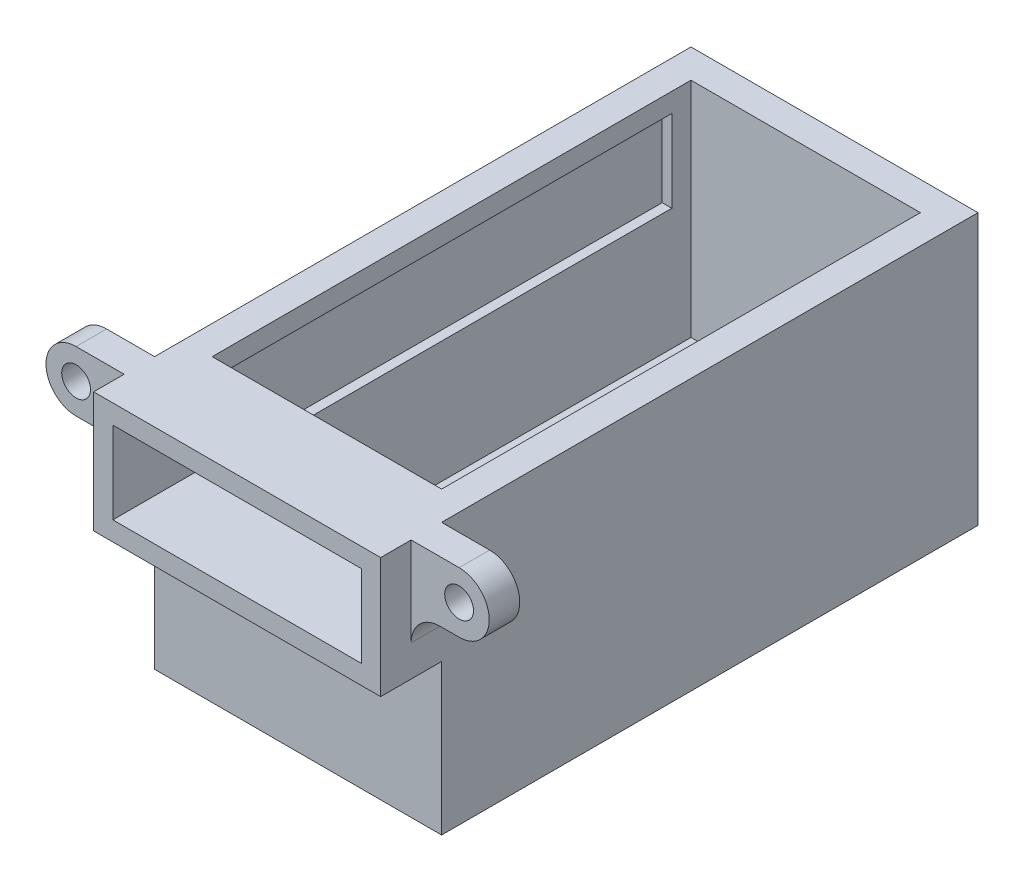
ISO-10303-21;
HEADER;
FILE_DESCRIPTION(('STEP AP214'),'2;1');
FILE_NAME('part.step','',(''),(''),'','','');
FILE_SCHEMA(('AUTOMOTIVE_DESIGN { 1 0 10303 214 1 1 1 1 }'));
ENDSEC;
DATA;
#1=APPLICATION_CONTEXT('core data for automotive mechanical design processes');
#2=APPLICATION_PROTOCOL_DEFINITION('international standard','automotive_design',2000,#1);
#3=PRODUCT_CONTEXT('',#1,'mechanical');
#4=PRODUCT('Part','Part','',(#3));
#5=PRODUCT_RELATED_PRODUCT_CATEGORY('part','',(#4));
#6=PRODUCT_DEFINITION_FORMATION('','',#4);
#7=PRODUCT_DEFINITION_CONTEXT('part definition',#1,'design');
#8=PRODUCT_DEFINITION('design','',#6,#7);
#9=PRODUCT_DEFINITION_SHAPE('','',#8);
#10=(LENGTH_UNIT() NAMED_UNIT(*) SI_UNIT(.MILLI.,.METRE.));
#11=(NAMED_UNIT(*) PLANE_ANGLE_UNIT() SI_UNIT($,.RADIAN.));
#12=(NAMED_UNIT(*) SI_UNIT($,.STERADIAN.) SOLID_ANGLE_UNIT());
#13=UNCERTAINTY_MEASURE_WITH_UNIT(LENGTH_MEASURE(1.E-05),#10,'distance_accuracy_value','');
#14=(GEOMETRIC_REPRESENTATION_CONTEXT(3) GLOBAL_UNCERTAINTY_ASSIGNED_CONTEXT((#13)) GLOBAL_UNIT_ASSIGNED_CONTEXT((#10,
#11,#12)) REPRESENTATION_CONTEXT('',''));
#15=CARTESIAN_POINT('',(0.,0.,0.));
#16=DIRECTION('',(0.,0.,1.));
#17=DIRECTION('',(1.,0.,0.));
#18=AXIS2_PLACEMENT_3D('',#15,#16,#17);
#19=CARTESIAN_POINT('',(0.,0.,-50.88));
#20=DIRECTION('',(0.,0.,-1.));
#21=DIRECTION('',(-1.,0.,0.));
#22=AXIS2_PLACEMENT_3D('',#19,#20,#21);
#23=PLANE('',#22);
#24=DIRECTION('',(-1.,0.,0.));
#25=VECTOR('',#24,1.);
#26=CARTESIAN_POINT('',(2.,10.55,-50.88));
#27=LINE('',#26,#25);
#28=CARTESIAN_POINT('',(27.9,10.55,-50.88));
#29=VERTEX_POINT('',#28);
#30=CARTESIAN_POINT('',(26.9,10.55,-50.88));
#31=VERTEX_POINT('',#30);
#32=EDGE_CURVE('E302',#29,#31,#27,.T.);
#33=ORIENTED_EDGE('',*,*,#32,.T.);
#34=DIRECTION('',(0.,-1.,0.));
#35=VECTOR('',#34,1.);
#36=CARTESIAN_POINT('',(26.9,0.,-50.88));
#37=LINE('',#36,#35);
#38=CARTESIAN_POINT('',(26.9,2.,-50.88));
#39=VERTEX_POINT('',#38);
#40=EDGE_CURVE('E271',#31,#39,#37,.T.);
#41=ORIENTED_EDGE('',*,*,#40,.T.);
#42=DIRECTION('',(1.,0.,0.));
#43=VECTOR('',#42,1.);
#44=CARTESIAN_POINT('',(27.9,2.,-50.88));
#45=LINE('',#44,#43);
#46=CARTESIAN_POINT('',(27.9,2.,-50.88));
#47=VERTEX_POINT('',#46);
#48=EDGE_CURVE('E296',#39,#47,#45,.T.);
#49=ORIENTED_EDGE('',*,*,#48,.T.);
#50=DIRECTION('',(0.,1.,0.));
#51=VECTOR('',#50,1.);
#52=CARTESIAN_POINT('',(27.9,10.55,-50.88));
#53=LINE('',#52,#51);
#54=EDGE_CURVE('E280',#47,#29,#53,.T.);
#55=ORIENTED_EDGE('',*,*,#54,.T.);
#56=EDGE_LOOP('',(#33,#41,#49,#55));
#57=FACE_BOUND('',#56,.T.);
#58=ADVANCED_FACE('F40',(#57),#23,.F.);
#59=CARTESIAN_POINT('',(0.,0.,3.175));
#60=DIRECTION('',(-1.,0.,0.));
#61=DIRECTION('',(0.,0.,1.));
#62=AXIS2_PLACEMENT_3D('',#59,#60,#61);
#63=PLANE('',#62);
#64=DIRECTION('',(0.,-1.,0.));
#65=VECTOR('',#64,1.);
#66=CARTESIAN_POINT('',(0.,0.,3.175));
#67=LINE('',#66,#65);
#68=CARTESIAN_POINT('',(0.,12.55,3.175));
#69=VERTEX_POINT('',#68);
#70=CARTESIAN_POINT('',(0.,3.27500000000001,3.175));
#71=VERTEX_POINT('',#70);
#72=EDGE_CURVE('E362',#69,#71,#67,.T.);
#73=ORIENTED_EDGE('',*,*,#72,.T.);
#74=DIRECTION('',(0.,0.,1.));
#75=VECTOR('',#74,1.);
#76=CARTESIAN_POINT('',(0.,3.27500000000001,-4.24264068711929));
#77=LINE('',#76,#75);
#78=CARTESIAN_POINT('',(0.,3.275,0.));
#79=VERTEX_POINT('',#78);
#80=EDGE_CURVE('E312',#79,#71,#77,.T.);
#81=ORIENTED_EDGE('',*,*,#80,.F.);
#82=DIRECTION('',(0.,1.,0.));
#83=VECTOR('',#82,1.);
#84=CARTESIAN_POINT('',(0.,-15.661,0.));
#85=LINE('',#84,#83);
#86=CARTESIAN_POINT('',(0.,12.55,0.));
#87=VERTEX_POINT('',#86);
#88=EDGE_CURVE('E350',#79,#87,#85,.T.);
#89=ORIENTED_EDGE('',*,*,#88,.T.);
#90=DIRECTION('',(0.,0.,1.));
#91=VECTOR('',#90,1.);
#92=CARTESIAN_POINT('',(0.,12.55,-55.88));
#93=LINE('',#92,#91);
#94=CARTESIAN_POINT('',(0.,12.55,-55.88));
#95=VERTEX_POINT('',#94);
#96=EDGE_CURVE('E353',#95,#87,#93,.T.);
#97=ORIENTED_EDGE('',*,*,#96,.F.);
#98=DIRECTION('',(0.,1.,0.));
#99=VECTOR('',#98,1.);
#100=CARTESIAN_POINT('',(0.,-15.661,-55.88));
#101=LINE('',#100,#99);
#102=CARTESIAN_POINT('',(0.,-15.661,-55.88));
#103=VERTEX_POINT('',#102);
#104=EDGE_CURVE('E339',#103,#95,#101,.T.);
#105=ORIENTED_EDGE('',*,*,#104,.F.);
#106=DIRECTION('',(0.,0.,1.));
#107=VECTOR('',#106,1.);
#108=CARTESIAN_POINT('',(0.,-15.661,-55.88));
#109=LINE('',#108,#107);
#110=CARTESIAN_POINT('',(0.,-15.661,0.));
#111=VERTEX_POINT('',#110);
#112=EDGE_CURVE('E356',#103,#111,#109,.T.);
#113=ORIENTED_EDGE('',*,*,#112,.T.);
#114=CARTESIAN_POINT('',(0.,0.,0.));
#115=VERTEX_POINT('',#114);
#116=EDGE_CURVE('E337',#111,#115,#85,.T.);
#117=ORIENTED_EDGE('',*,*,#116,.T.);
#118=DIRECTION('',(0.,0.,-1.));
#119=VECTOR('',#118,1.);
#120=CARTESIAN_POINT('',(0.,0.,3.175));
#121=LINE('',#120,#119);
#122=CARTESIAN_POINT('',(0.,0.,6.35));
#123=VERTEX_POINT('',#122);
#124=EDGE_CURVE('E406',#123,#115,#121,.T.);
#125=ORIENTED_EDGE('',*,*,#124,.F.);
#126=DIRECTION('',(0.,-1.,0.));
#127=VECTOR('',#126,1.);
#128=CARTESIAN_POINT('',(0.,0.,6.35));
#129=LINE('',#128,#127);
#130=CARTESIAN_POINT('',(0.,12.55,6.35));
#131=VERTEX_POINT('',#130);
#132=EDGE_CURVE('E370',#131,#123,#129,.T.);
#133=ORIENTED_EDGE('',*,*,#132,.F.);
#134=DIRECTION('',(0.,0.,-1.));
#135=VECTOR('',#134,1.);
#136=CARTESIAN_POINT('',(0.,12.55,6.35));
#137=LINE('',#136,#135);
#138=EDGE_CURVE('E373',#131,#69,#137,.T.);
#139=ORIENTED_EDGE('',*,*,#138,.T.);
#140=EDGE_LOOP('',(#73,#81,#89,#97,#105,#113,#117,#125,#133,#139));
#141=FACE_BOUND('',#140,.T.);
#142=ADVANCED_FACE('F465',(#141),#63,.T.);
#143=CARTESIAN_POINT('',(0.,6.275,3.175));
#144=DIRECTION('',(0.,1.,0.));
#145=DIRECTION('',(-1.,0.,0.));
#146=AXIS2_PLACEMENT_3D('',#143,#144,#145);
#147=PLANE('',#146);
#148=DIRECTION('',(0.,0.,1.));
#149=VECTOR('',#148,1.);
#150=CARTESIAN_POINT('',(32.9,6.275,-4.24264068711929));
#151=LINE('',#150,#149);
#152=CARTESIAN_POINT('',(32.9,6.275,0.));
#153=VERTEX_POINT('',#152);
#154=CARTESIAN_POINT('',(32.9,6.275,3.175));
#155=VERTEX_POINT('',#154);
#156=EDGE_CURVE('E329',#153,#155,#151,.T.);
#157=ORIENTED_EDGE('',*,*,#156,.F.);
#158=DIRECTION('',(1.,0.,0.));
#159=VECTOR('',#158,1.);
#160=CARTESIAN_POINT('',(0.,6.275,0.));
#161=LINE('',#160,#159);
#162=CARTESIAN_POINT('',(34.9,6.275,0.));
#163=VERTEX_POINT('',#162);
#164=EDGE_CURVE('E409',#153,#163,#161,.T.);
#165=ORIENTED_EDGE('',*,*,#164,.T.);
#166=DIRECTION('',(0.,0.,-1.));
#167=VECTOR('',#166,1.);
#168=CARTESIAN_POINT('',(34.9,6.275,3.175));
#169=LINE('',#168,#167);
#170=CARTESIAN_POINT('',(34.9,6.275,3.175));
#171=VERTEX_POINT('',#170);
#172=EDGE_CURVE('E436',#171,#163,#169,.T.);
#173=ORIENTED_EDGE('',*,*,#172,.F.);
#174=DIRECTION('',(1.,0.,0.));
#175=VECTOR('',#174,1.);
#176=CARTESIAN_POINT('',(0.,6.275,3.175));
#177=LINE('',#176,#175);
#178=EDGE_CURVE('E385',#155,#171,#177,.T.);
#179=ORIENTED_EDGE('',*,*,#178,.F.);
#180=EDGE_LOOP('',(#157,#165,#173,#179));
#181=FACE_BOUND('',#180,.T.);
#182=ADVANCED_FACE('F472',(#181),#147,.F.);
#183=CARTESIAN_POINT('',(0.,0.,0.));
#184=DIRECTION('',(0.,0.,1.));
#185=DIRECTION('',(1.,0.,0.));
#186=AXIS2_PLACEMENT_3D('',#183,#184,#185);
#187=PLANE('',#186);
#188=CARTESIAN_POINT('',(34.9,9.41250000000001,0.));
#189=DIRECTION('',(0.,0.,1.));
#190=DIRECTION('',(1.,0.,0.));
#191=AXIS2_PLACEMENT_3D('',#188,#189,#190);
#192=CIRCLE('',#191,1.5);
#193=CARTESIAN_POINT('',(36.4,9.41250000000001,0.));
#194=VERTEX_POINT('',#193);
#195=EDGE_CURVE('E388',#194,#194,#192,.T.);
#196=ORIENTED_EDGE('',*,*,#195,.T.);
#197=EDGE_LOOP('',(#196));
#198=FACE_BOUND('',#197,.T.);
#199=DIRECTION('',(0.,-1.,0.));
#200=VECTOR('',#199,1.);
#201=CARTESIAN_POINT('',(29.9,0.,0.));
#202=LINE('',#201,#200);
#203=CARTESIAN_POINT('',(29.9,12.55,0.));
#204=VERTEX_POINT('',#203);
#205=CARTESIAN_POINT('',(29.9,3.27500000000001,0.));
#206=VERTEX_POINT('',#205);
#207=EDGE_CURVE('E344',#204,#206,#202,.T.);
#208=ORIENTED_EDGE('',*,*,#207,.F.);
#209=DIRECTION('',(1.,0.,0.));
#210=VECTOR('',#209,1.);
#211=CARTESIAN_POINT('',(0.,12.55,0.));
#212=LINE('',#211,#210);
#213=CARTESIAN_POINT('',(34.9,12.55,0.));
#214=VERTEX_POINT('',#213);
#215=EDGE_CURVE('E414',#204,#214,#212,.T.);
#216=ORIENTED_EDGE('',*,*,#215,.T.);
#217=CARTESIAN_POINT('',(34.9,9.41250000000001,0.));
#218=DIRECTION('',(0.,0.,1.));
#219=DIRECTION('',(1.,0.,0.));
#220=AXIS2_PLACEMENT_3D('',#217,#218,#219);
#221=CIRCLE('',#220,3.1375);
#222=EDGE_CURVE('E411',#214,#163,#221,.F.);
#223=ORIENTED_EDGE('',*,*,#222,.T.);
#224=ORIENTED_EDGE('',*,*,#164,.F.);
#225=CARTESIAN_POINT('',(32.9,3.275,0.));
#226=DIRECTION('',(0.,0.,1.));
#227=DIRECTION('',(1.,0.,0.));
#228=AXIS2_PLACEMENT_3D('',#225,#226,#227);
#229=CIRCLE('',#228,3.);
#230=EDGE_CURVE('E323',#206,#153,#229,.F.);
#231=ORIENTED_EDGE('',*,*,#230,.F.);
#232=EDGE_LOOP('',(#208,#216,#223,#224,#231));
#233=FACE_BOUND('',#232,.T.);
#234=ADVANCED_FACE('F668',(#198,#233),#187,.F.);
#235=CARTESIAN_POINT('',(-5.,9.4125,0.));
#236=DIRECTION('',(0.,0.,1.));
#237=DIRECTION('',(1.,0.,0.));
#238=AXIS2_PLACEMENT_3D('',#235,#236,#237);
#239=CIRCLE('',#238,1.5);
#240=CARTESIAN_POINT('',(-3.5,9.4125,0.));
#241=VERTEX_POINT('',#240);
#242=EDGE_CURVE('E422',#241,#241,#239,.T.);
#243=ORIENTED_EDGE('',*,*,#242,.T.);
#244=EDGE_LOOP('',(#243));
#245=FACE_BOUND('',#244,.T.);
#246=ORIENTED_EDGE('',*,*,#88,.F.);
#247=CARTESIAN_POINT('',(-3.,3.275,0.));
#248=DIRECTION('',(0.,0.,1.));
#249=DIRECTION('',(1.,0.,0.));
#250=AXIS2_PLACEMENT_3D('',#247,#248,#249);
#251=CIRCLE('',#250,3.);
#252=CARTESIAN_POINT('',(-3.,6.275,0.));
#253=VERTEX_POINT('',#252);
#254=EDGE_CURVE('E311',#79,#253,#251,.T.);
#255=ORIENTED_EDGE('',*,*,#254,.T.);
#256=DIRECTION('',(-1.,0.,0.));
#257=VECTOR('',#256,1.);
#258=CARTESIAN_POINT('',(0.,6.275,0.));
#259=LINE('',#258,#257);
#260=CARTESIAN_POINT('',(-5.,6.275,0.));
#261=VERTEX_POINT('',#260);
#262=EDGE_CURVE('E420',#253,#261,#259,.T.);
#263=ORIENTED_EDGE('',*,*,#262,.T.);
#264=CARTESIAN_POINT('',(-5.,9.4125,0.));
#265=DIRECTION('',(0.,0.,1.));
#266=DIRECTION('',(1.,0.,0.));
#267=AXIS2_PLACEMENT_3D('',#264,#265,#266);
#268=CIRCLE('',#267,3.1375);
#269=CARTESIAN_POINT('',(-5.,12.55,0.));
#270=VERTEX_POINT('',#269);
#271=EDGE_CURVE('E417',#270,#261,#268,.T.);
#272=ORIENTED_EDGE('',*,*,#271,.F.);
#273=EDGE_CURVE('E415',#270,#87,#212,.T.);
#274=ORIENTED_EDGE('',*,*,#273,.T.);
#275=EDGE_LOOP('',(#246,#255,#263,#272,#274));
#276=FACE_BOUND('',#275,.T.);
#277=ADVANCED_FACE('F658',(#245,#276),#187,.F.);
#278=CARTESIAN_POINT('',(0.,0.,3.175));
#279=DIRECTION('',(0.,0.,1.));
#280=DIRECTION('',(1.,0.,0.));
#281=AXIS2_PLACEMENT_3D('',#278,#279,#280);
#282=PLANE('',#281);
#283=ORIENTED_EDGE('',*,*,#72,.F.);
#284=DIRECTION('',(1.,0.,0.));
#285=VECTOR('',#284,1.);
#286=CARTESIAN_POINT('',(0.,12.55,3.175));
#287=LINE('',#286,#285);
#288=CARTESIAN_POINT('',(-5.,12.55,3.175));
#289=VERTEX_POINT('',#288);
#290=EDGE_CURVE('E392',#289,#69,#287,.T.);
#291=ORIENTED_EDGE('',*,*,#290,.F.);
#292=CARTESIAN_POINT('',(-5.,9.4125,3.175));
#293=DIRECTION('',(0.,0.,1.));
#294=DIRECTION('',(1.,0.,0.));
#295=AXIS2_PLACEMENT_3D('',#292,#293,#294);
#296=CIRCLE('',#295,3.1375);
#297=CARTESIAN_POINT('',(-5.,6.275,3.175));
#298=VERTEX_POINT('',#297);
#299=EDGE_CURVE('E395',#289,#298,#296,.T.);
#300=ORIENTED_EDGE('',*,*,#299,.T.);
#301=DIRECTION('',(-1.,0.,0.));
#302=VECTOR('',#301,1.);
#303=CARTESIAN_POINT('',(0.,6.275,3.175));
#304=LINE('',#303,#302);
#305=CARTESIAN_POINT('',(-3.,6.275,3.175));
#306=VERTEX_POINT('',#305);
#307=EDGE_CURVE('E398',#306,#298,#304,.T.);
#308=ORIENTED_EDGE('',*,*,#307,.F.);
#309=CARTESIAN_POINT('',(-3.,3.275,3.175));
#310=DIRECTION('',(0.,0.,-1.));
#311=DIRECTION('',(-1.,0.,0.));
#312=AXIS2_PLACEMENT_3D('',#309,#310,#311);
#313=CIRCLE('',#312,3.);
#314=EDGE_CURVE('E318',#306,#71,#313,.T.);
#315=ORIENTED_EDGE('',*,*,#314,.T.);
#316=EDGE_LOOP('',(#283,#291,#300,#308,#315));
#317=FACE_BOUND('',#316,.T.);
#318=CARTESIAN_POINT('',(-5.,9.4125,3.175));
#319=DIRECTION('',(0.,0.,1.));
#320=DIRECTION('',(1.,0.,0.));
#321=AXIS2_PLACEMENT_3D('',#318,#319,#320);
#322=CIRCLE('',#321,1.5);
#323=CARTESIAN_POINT('',(-3.5,9.4125,3.175));
#324=VERTEX_POINT('',#323);
#325=EDGE_CURVE('E400',#324,#324,#322,.T.);
#326=ORIENTED_EDGE('',*,*,#325,.F.);
#327=EDGE_LOOP('',(#326));
#328=FACE_BOUND('',#327,.T.);
#329=ADVANCED_FACE('F617',(#317,#328),#282,.T.);
#330=CARTESIAN_POINT('',(0.,0.,3.175));
#331=DIRECTION('',(0.,-1.,0.));
#332=DIRECTION('',(1.,0.,0.));
#333=AXIS2_PLACEMENT_3D('',#330,#331,#332);
#334=PLANE('',#333);
#335=DIRECTION('',(-1.,0.,0.));
#336=VECTOR('',#335,1.);
#337=CARTESIAN_POINT('',(0.,0.,0.));
#338=LINE('',#337,#336);
#339=CARTESIAN_POINT('',(29.9,0.,0.));
#340=VERTEX_POINT('',#339);
#341=EDGE_CURVE('E384',#340,#115,#338,.T.);
#342=ORIENTED_EDGE('',*,*,#341,.F.);
#343=DIRECTION('',(0.,0.,-1.));
#344=VECTOR('',#343,1.);
#345=CARTESIAN_POINT('',(29.9,0.,3.175));
#346=LINE('',#345,#344);
#347=CARTESIAN_POINT('',(29.9,0.,6.35));
#348=VERTEX_POINT('',#347);
#349=EDGE_CURVE('E377',#348,#340,#346,.T.);
#350=ORIENTED_EDGE('',*,*,#349,.F.);
#351=DIRECTION('',(1.,0.,0.));
#352=VECTOR('',#351,1.);
#353=CARTESIAN_POINT('',(0.,0.,6.35));
#354=LINE('',#353,#352);
#355=EDGE_CURVE('E363',#123,#348,#354,.T.);
#356=ORIENTED_EDGE('',*,*,#355,.F.);
#357=ORIENTED_EDGE('',*,*,#124,.T.);
#358=EDGE_LOOP('',(#342,#350,#356,#357));
#359=FACE_BOUND('',#358,.T.);
#360=ADVANCED_FACE('F42',(#359),#334,.T.);
#361=CARTESIAN_POINT('',(29.9,0.,3.175));
#362=DIRECTION('',(1.,0.,0.));
#363=DIRECTION('',(0.,0.,-1.));
#364=AXIS2_PLACEMENT_3D('',#361,#362,#363);
#365=PLANE('',#364);
#366=DIRECTION('',(0.,0.,1.));
#367=VECTOR('',#366,1.);
#368=CARTESIAN_POINT('',(29.9,3.27500000000001,-4.24264068711929));
#369=LINE('',#368,#367);
#370=CARTESIAN_POINT('',(29.9,3.27500000000001,3.175));
#371=VERTEX_POINT('',#370);
#372=EDGE_CURVE('E326',#206,#371,#369,.T.);
#373=ORIENTED_EDGE('',*,*,#372,.T.);
#374=DIRECTION('',(0.,1.,0.));
#375=VECTOR('',#374,1.);
#376=CARTESIAN_POINT('',(29.9,0.,3.175));
#377=LINE('',#376,#375);
#378=CARTESIAN_POINT('',(29.9,12.55,3.175));
#379=VERTEX_POINT('',#378);
#380=EDGE_CURVE('E374',#371,#379,#377,.T.);
#381=ORIENTED_EDGE('',*,*,#380,.T.);
#382=DIRECTION('',(0.,0.,-1.));
#383=VECTOR('',#382,1.);
#384=CARTESIAN_POINT('',(29.9,12.55,6.35));
#385=LINE('',#384,#383);
#386=CARTESIAN_POINT('',(29.9,12.55,6.35));
#387=VERTEX_POINT('',#386);
#388=EDGE_CURVE('E381',#387,#379,#385,.T.);
#389=ORIENTED_EDGE('',*,*,#388,.F.);
#390=DIRECTION('',(0.,1.,0.));
#391=VECTOR('',#390,1.);
#392=CARTESIAN_POINT('',(29.9,0.,6.35));
#393=LINE('',#392,#391);
#394=EDGE_CURVE('E366',#348,#387,#393,.T.);
#395=ORIENTED_EDGE('',*,*,#394,.F.);
#396=ORIENTED_EDGE('',*,*,#349,.T.);
#397=CARTESIAN_POINT('',(29.9,-15.661,0.));
#398=VERTEX_POINT('',#397);
#399=EDGE_CURVE('E325',#340,#398,#202,.T.);
#400=ORIENTED_EDGE('',*,*,#399,.T.);
#401=DIRECTION('',(0.,0.,1.));
#402=VECTOR('',#401,1.);
#403=CARTESIAN_POINT('',(29.9,-15.661,-55.88));
#404=LINE('',#403,#402);
#405=CARTESIAN_POINT('',(29.9,-15.661,-55.88));
#406=VERTEX_POINT('',#405);
#407=EDGE_CURVE('E359',#406,#398,#404,.T.);
#408=ORIENTED_EDGE('',*,*,#407,.F.);
#409=DIRECTION('',(0.,-1.,0.));
#410=VECTOR('',#409,1.);
#411=CARTESIAN_POINT('',(29.9,12.55,-55.88));
#412=LINE('',#411,#410);
#413=CARTESIAN_POINT('',(29.9,12.55,-55.88));
#414=VERTEX_POINT('',#413);
#415=EDGE_CURVE('E334',#414,#406,#412,.T.);
#416=ORIENTED_EDGE('',*,*,#415,.F.);
#417=DIRECTION('',(0.,0.,1.));
#418=VECTOR('',#417,1.);
#419=CARTESIAN_POINT('',(29.9,12.55,-55.88));
#420=LINE('',#419,#418);
#421=EDGE_CURVE('E343',#414,#204,#420,.T.);
#422=ORIENTED_EDGE('',*,*,#421,.T.);
#423=ORIENTED_EDGE('',*,*,#207,.T.);
#424=EDGE_LOOP('',(#373,#381,#389,#395,#396,#400,#408,#416,#422,#423));
#425=FACE_BOUND('',#424,.T.);
#426=ADVANCED_FACE('F641',(#425),#365,.T.);
#427=CARTESIAN_POINT('',(34.9,9.41250000000001,3.175));
#428=DIRECTION('',(0.,0.,-1.));
#429=DIRECTION('',(-1.,0.,0.));
#430=AXIS2_PLACEMENT_3D('',#427,#428,#429);
#431=CYLINDRICAL_SURFACE('',#430,3.1375);
#432=ORIENTED_EDGE('',*,*,#222,.F.);
#433=DIRECTION('',(0.,0.,-1.));
#434=VECTOR('',#433,1.);
#435=CARTESIAN_POINT('',(34.9,12.55,3.175));
#436=LINE('',#435,#434);
#437=CARTESIAN_POINT('',(34.9,12.55,3.175));
#438=VERTEX_POINT('',#437);
#439=EDGE_CURVE('E433',#438,#214,#436,.T.);
#440=ORIENTED_EDGE('',*,*,#439,.F.);
#441=CARTESIAN_POINT('',(34.9,9.41250000000001,3.175));
#442=DIRECTION('',(0.,0.,1.));
#443=DIRECTION('',(1.,0.,0.));
#444=AXIS2_PLACEMENT_3D('',#441,#442,#443);
#445=CIRCLE('',#444,3.1375);
#446=EDGE_CURVE('E387',#438,#171,#445,.F.);
#447=ORIENTED_EDGE('',*,*,#446,.T.);
#448=ORIENTED_EDGE('',*,*,#172,.T.);
#449=EDGE_LOOP('',(#432,#440,#447,#448));
#450=FACE_BOUND('',#449,.T.);
#451=ADVANCED_FACE('F646',(#450),#431,.T.);
#452=CARTESIAN_POINT('',(0.,12.55,3.175));
#453=DIRECTION('',(0.,1.,0.));
#454=DIRECTION('',(-1.,0.,0.));
#455=AXIS2_PLACEMENT_3D('',#452,#453,#454);
#456=PLANE('',#455);
#457=DIRECTION('',(0.,0.,-1.));
#458=VECTOR('',#457,1.);
#459=CARTESIAN_POINT('',(26.9,12.55,-3.));
#460=LINE('',#459,#458);
#461=CARTESIAN_POINT('',(26.9,12.55,-3.));
#462=VERTEX_POINT('',#461);
#463=CARTESIAN_POINT('',(26.9,12.55,-52.88));
#464=VERTEX_POINT('',#463);
#465=EDGE_CURVE('E55',#462,#464,#460,.T.);
#466=ORIENTED_EDGE('',*,*,#465,.F.);
#467=DIRECTION('',(1.,0.,0.));
#468=VECTOR('',#467,1.);
#469=CARTESIAN_POINT('',(3.00000000000001,12.55,-3.));
#470=LINE('',#469,#468);
#471=CARTESIAN_POINT('',(3.00000000000001,12.55,-3.));
#472=VERTEX_POINT('',#471);
#473=EDGE_CURVE('E248',#472,#462,#470,.T.);
#474=ORIENTED_EDGE('',*,*,#473,.F.);
#475=DIRECTION('',(0.,0.,1.));
#476=VECTOR('',#475,1.);
#477=CARTESIAN_POINT('',(3.,12.55,-52.88));
#478=LINE('',#477,#476);
#479=CARTESIAN_POINT('',(3.,12.55,-52.88));
#480=VERTEX_POINT('',#479);
#481=EDGE_CURVE('E230',#480,#472,#478,.T.);
#482=ORIENTED_EDGE('',*,*,#481,.F.);
#483=DIRECTION('',(-1.,0.,0.));
#484=VECTOR('',#483,1.);
#485=CARTESIAN_POINT('',(26.9,12.55,-52.88));
#486=LINE('',#485,#484);
#487=EDGE_CURVE('E241',#464,#480,#486,.T.);
#488=ORIENTED_EDGE('',*,*,#487,.F.);
#489=EDGE_LOOP('',(#466,#474,#482,#488));
#490=FACE_BOUND('',#489,.T.);
#491=ORIENTED_EDGE('',*,*,#273,.F.);
#492=DIRECTION('',(0.,0.,-1.));
#493=VECTOR('',#492,1.);
#494=CARTESIAN_POINT('',(-5.,12.55,3.175));
#495=LINE('',#494,#493);
#496=EDGE_CURVE('E431',#289,#270,#495,.T.);
#497=ORIENTED_EDGE('',*,*,#496,.F.);
#498=ORIENTED_EDGE('',*,*,#290,.T.);
#499=ORIENTED_EDGE('',*,*,#138,.F.);
#500=DIRECTION('',(-1.,0.,0.));
#501=VECTOR('',#500,1.);
#502=CARTESIAN_POINT('',(29.9,12.55,6.35));
#503=LINE('',#502,#501);
#504=EDGE_CURVE('E368',#387,#131,#503,.T.);
#505=ORIENTED_EDGE('',*,*,#504,.F.);
#506=ORIENTED_EDGE('',*,*,#388,.T.);
#507=EDGE_CURVE('E391',#379,#438,#287,.T.);
#508=ORIENTED_EDGE('',*,*,#507,.T.);
#509=ORIENTED_EDGE('',*,*,#439,.T.);
#510=ORIENTED_EDGE('',*,*,#215,.F.);
#511=ORIENTED_EDGE('',*,*,#421,.F.);
#512=DIRECTION('',(1.,0.,0.));
#513=VECTOR('',#512,1.);
#514=CARTESIAN_POINT('',(0.,12.55,-55.88));
#515=LINE('',#514,#513);
#516=EDGE_CURVE('E341',#95,#414,#515,.T.);
#517=ORIENTED_EDGE('',*,*,#516,.F.);
#518=ORIENTED_EDGE('',*,*,#96,.T.);
#519=EDGE_LOOP('',(#491,#497,#498,#499,#505,#506,#508,#509,#510,#511,#517,#518));
#520=FACE_BOUND('',#519,.T.);
#521=ADVANCED_FACE('F245',(#490,#520),#456,.T.);
#522=CARTESIAN_POINT('',(-5.,9.4125,3.175));
#523=DIRECTION('',(0.,0.,-1.));
#524=DIRECTION('',(-1.,0.,0.));
#525=AXIS2_PLACEMENT_3D('',#522,#523,#524);
#526=CYLINDRICAL_SURFACE('',#525,3.1375);
#527=ORIENTED_EDGE('',*,*,#271,.T.);
#528=DIRECTION('',(0.,0.,-1.));
#529=VECTOR('',#528,1.);
#530=CARTESIAN_POINT('',(-5.,6.275,3.175));
#531=LINE('',#530,#529);
#532=EDGE_CURVE('E428',#298,#261,#531,.T.);
#533=ORIENTED_EDGE('',*,*,#532,.F.);
#534=ORIENTED_EDGE('',*,*,#299,.F.);
#535=ORIENTED_EDGE('',*,*,#496,.T.);
#536=EDGE_LOOP('',(#527,#533,#534,#535));
#537=FACE_BOUND('',#536,.T.);
#538=ADVANCED_FACE('F631',(#537),#526,.T.);
#539=CARTESIAN_POINT('',(0.,6.275,3.175));
#540=DIRECTION('',(0.,-1.,0.));
#541=DIRECTION('',(0.,0.,-1.));
#542=AXIS2_PLACEMENT_3D('',#539,#540,#541);
#543=PLANE('',#542);
#544=DIRECTION('',(0.,0.,1.));
#545=VECTOR('',#544,1.);
#546=CARTESIAN_POINT('',(-3.,6.275,-4.24264068711929));
#547=LINE('',#546,#545);
#548=EDGE_CURVE('E315',#253,#306,#547,.T.);
#549=ORIENTED_EDGE('',*,*,#548,.T.);
#550=ORIENTED_EDGE('',*,*,#307,.T.);
#551=ORIENTED_EDGE('',*,*,#532,.T.);
#552=ORIENTED_EDGE('',*,*,#262,.F.);
#553=EDGE_LOOP('',(#549,#550,#551,#552));
#554=FACE_BOUND('',#553,.T.);
#555=ADVANCED_FACE('F625',(#554),#543,.T.);
#556=CARTESIAN_POINT('',(-5.,9.4125,3.175));
#557=DIRECTION('',(0.,0.,-1.));
#558=DIRECTION('',(-1.,0.,0.));
#559=AXIS2_PLACEMENT_3D('',#556,#557,#558);
#560=CYLINDRICAL_SURFACE('',#559,1.5);
#561=ORIENTED_EDGE('',*,*,#325,.T.);
#562=EDGE_LOOP('',(#561));
#563=FACE_BOUND('',#562,.T.);
#564=ORIENTED_EDGE('',*,*,#242,.F.);
#565=EDGE_LOOP('',(#564));
#566=FACE_BOUND('',#565,.T.);
#567=ADVANCED_FACE('F630',(#563,#566),#560,.F.);
#568=CARTESIAN_POINT('',(34.9,9.41250000000001,3.175));
#569=DIRECTION('',(0.,0.,-1.));
#570=DIRECTION('',(-1.,0.,0.));
#571=AXIS2_PLACEMENT_3D('',#568,#569,#570);
#572=CYLINDRICAL_SURFACE('',#571,1.5);
#573=CARTESIAN_POINT('',(34.9,9.41250000000001,3.175));
#574=DIRECTION('',(0.,0.,1.));
#575=DIRECTION('',(1.,0.,0.));
#576=AXIS2_PLACEMENT_3D('',#573,#574,#575);
#577=CIRCLE('',#576,1.5);
#578=CARTESIAN_POINT('',(36.4,9.41250000000001,3.175));
#579=VERTEX_POINT('',#578);
#580=EDGE_CURVE('E403',#579,#579,#577,.T.);
#581=ORIENTED_EDGE('',*,*,#580,.T.);
#582=EDGE_LOOP('',(#581));
#583=FACE_BOUND('',#582,.T.);
#584=ORIENTED_EDGE('',*,*,#195,.F.);
#585=EDGE_LOOP('',(#584));
#586=FACE_BOUND('',#585,.T.);
#587=ADVANCED_FACE('F614',(#583,#586),#572,.F.);
#588=ORIENTED_EDGE('',*,*,#380,.F.);
#589=CARTESIAN_POINT('',(32.9,3.275,3.175));
#590=DIRECTION('',(0.,0.,1.));
#591=DIRECTION('',(1.,0.,0.));
#592=AXIS2_PLACEMENT_3D('',#589,#590,#591);
#593=CIRCLE('',#592,3.);
#594=EDGE_CURVE('E321',#155,#371,#593,.T.);
#595=ORIENTED_EDGE('',*,*,#594,.F.);
#596=ORIENTED_EDGE('',*,*,#178,.T.);
#597=ORIENTED_EDGE('',*,*,#446,.F.);
#598=ORIENTED_EDGE('',*,*,#507,.F.);
#599=EDGE_LOOP('',(#588,#595,#596,#597,#598));
#600=FACE_BOUND('',#599,.T.);
#601=ORIENTED_EDGE('',*,*,#580,.F.);
#602=EDGE_LOOP('',(#601));
#603=FACE_BOUND('',#602,.T.);
#604=ADVANCED_FACE('F610',(#600,#603),#282,.T.);
#605=CARTESIAN_POINT('',(0.,0.,6.35));
#606=DIRECTION('',(0.,0.,1.));
#607=DIRECTION('',(1.,0.,0.));
#608=AXIS2_PLACEMENT_3D('',#605,#606,#607);
#609=PLANE('',#608);
#610=DIRECTION('',(0.,1.,0.));
#611=VECTOR('',#610,1.);
#612=CARTESIAN_POINT('',(27.9,10.55,6.35));
#613=LINE('',#612,#611);
#614=CARTESIAN_POINT('',(27.9,2.,6.35));
#615=VERTEX_POINT('',#614);
#616=CARTESIAN_POINT('',(27.9,10.55,6.35));
#617=VERTEX_POINT('',#616);
#618=EDGE_CURVE('E284',#615,#617,#613,.T.);
#619=ORIENTED_EDGE('',*,*,#618,.F.);
#620=DIRECTION('',(1.,0.,0.));
#621=VECTOR('',#620,1.);
#622=CARTESIAN_POINT('',(27.9,2.,6.35));
#623=LINE('',#622,#621);
#624=CARTESIAN_POINT('',(2.,2.,6.35));
#625=VERTEX_POINT('',#624);
#626=EDGE_CURVE('E277',#625,#615,#623,.T.);
#627=ORIENTED_EDGE('',*,*,#626,.F.);
#628=DIRECTION('',(0.,-1.,0.));
#629=VECTOR('',#628,1.);
#630=CARTESIAN_POINT('',(2.,2.,6.35));
#631=LINE('',#630,#629);
#632=CARTESIAN_POINT('',(2.,10.55,6.35));
#633=VERTEX_POINT('',#632);
#634=EDGE_CURVE('E278',#633,#625,#631,.T.);
#635=ORIENTED_EDGE('',*,*,#634,.F.);
#636=DIRECTION('',(-1.,0.,0.));
#637=VECTOR('',#636,1.);
#638=CARTESIAN_POINT('',(2.,10.55,6.35));
#639=LINE('',#638,#637);
#640=EDGE_CURVE('E281',#617,#633,#639,.T.);
#641=ORIENTED_EDGE('',*,*,#640,.F.);
#642=EDGE_LOOP('',(#619,#627,#635,#641));
#643=FACE_BOUND('',#642,.T.);
#644=ORIENTED_EDGE('',*,*,#355,.T.);
#645=ORIENTED_EDGE('',*,*,#394,.T.);
#646=ORIENTED_EDGE('',*,*,#504,.T.);
#647=ORIENTED_EDGE('',*,*,#132,.T.);
#648=EDGE_LOOP('',(#644,#645,#646,#647));
#649=FACE_BOUND('',#648,.T.);
#650=ADVANCED_FACE('F500',(#643,#649),#609,.T.);
#651=CARTESIAN_POINT('',(0.,0.,0.));
#652=DIRECTION('',(0.,0.,-1.));
#653=DIRECTION('',(-1.,0.,0.));
#654=AXIS2_PLACEMENT_3D('',#651,#652,#653);
#655=PLANE('',#654);
#656=ORIENTED_EDGE('',*,*,#399,.F.);
#657=ORIENTED_EDGE('',*,*,#341,.T.);
#658=ORIENTED_EDGE('',*,*,#116,.F.);
#659=DIRECTION('',(-1.,0.,0.));
#660=VECTOR('',#659,1.);
#661=CARTESIAN_POINT('',(29.9,-15.661,0.));
#662=LINE('',#661,#660);
#663=EDGE_CURVE('E346',#398,#111,#662,.T.);
#664=ORIENTED_EDGE('',*,*,#663,.F.);
#665=EDGE_LOOP('',(#656,#657,#658,#664));
#666=FACE_BOUND('',#665,.T.);
#667=ADVANCED_FACE('F714',(#666),#655,.F.);
#668=CARTESIAN_POINT('',(29.9,-15.661,-55.88));
#669=DIRECTION('',(0.,1.,0.));
#670=DIRECTION('',(0.,0.,1.));
#671=AXIS2_PLACEMENT_3D('',#668,#669,#670);
#672=PLANE('',#671);
#673=ORIENTED_EDGE('',*,*,#663,.T.);
#674=ORIENTED_EDGE('',*,*,#112,.F.);
#675=DIRECTION('',(-1.,0.,0.));
#676=VECTOR('',#675,1.);
#677=CARTESIAN_POINT('',(29.9,-15.661,-55.88));
#678=LINE('',#677,#676);
#679=EDGE_CURVE('E336',#406,#103,#678,.T.);
#680=ORIENTED_EDGE('',*,*,#679,.F.);
#681=ORIENTED_EDGE('',*,*,#407,.T.);
#682=EDGE_LOOP('',(#673,#674,#680,#681));
#683=FACE_BOUND('',#682,.T.);
#684=ADVANCED_FACE('F704',(#683),#672,.F.);
#685=CARTESIAN_POINT('',(0.,0.,-55.88));
#686=DIRECTION('',(0.,0.,-1.));
#687=DIRECTION('',(-1.,0.,0.));
#688=AXIS2_PLACEMENT_3D('',#685,#686,#687);
#689=PLANE('',#688);
#690=ORIENTED_EDGE('',*,*,#415,.T.);
#691=ORIENTED_EDGE('',*,*,#679,.T.);
#692=ORIENTED_EDGE('',*,*,#104,.T.);
#693=ORIENTED_EDGE('',*,*,#516,.T.);
#694=EDGE_LOOP('',(#690,#691,#692,#693));
#695=FACE_BOUND('',#694,.T.);
#696=ADVANCED_FACE('F600',(#695),#689,.T.);
#697=CARTESIAN_POINT('',(32.9,3.275,-4.24264068711929));
#698=DIRECTION('',(0.,0.,1.));
#699=DIRECTION('',(1.,0.,0.));
#700=AXIS2_PLACEMENT_3D('',#697,#698,#699);
#701=CYLINDRICAL_SURFACE('',#700,3.);
#702=ORIENTED_EDGE('',*,*,#372,.F.);
#703=ORIENTED_EDGE('',*,*,#230,.T.);
#704=ORIENTED_EDGE('',*,*,#156,.T.);
#705=ORIENTED_EDGE('',*,*,#594,.T.);
#706=EDGE_LOOP('',(#702,#703,#704,#705));
#707=FACE_BOUND('',#706,.T.);
#708=ADVANCED_FACE('F487',(#707),#701,.F.);
#709=CARTESIAN_POINT('',(-3.,3.275,-4.24264068711929));
#710=DIRECTION('',(0.,0.,1.));
#711=DIRECTION('',(1.,0.,0.));
#712=AXIS2_PLACEMENT_3D('',#709,#710,#711);
#713=CYLINDRICAL_SURFACE('',#712,3.);
#714=ORIENTED_EDGE('',*,*,#254,.F.);
#715=ORIENTED_EDGE('',*,*,#80,.T.);
#716=ORIENTED_EDGE('',*,*,#314,.F.);
#717=ORIENTED_EDGE('',*,*,#548,.F.);
#718=EDGE_LOOP('',(#714,#715,#716,#717));
#719=FACE_BOUND('',#718,.T.);
#720=ADVANCED_FACE('F479',(#719),#713,.F.);
#721=CARTESIAN_POINT('',(2.,2.,-50.88));
#722=VERTEX_POINT('',#721);
#723=CARTESIAN_POINT('',(3.,2.,-50.88));
#724=VERTEX_POINT('',#723);
#725=EDGE_CURVE('E292',#722,#724,#45,.T.);
#726=ORIENTED_EDGE('',*,*,#725,.T.);
#727=DIRECTION('',(0.,1.,0.));
#728=VECTOR('',#727,1.);
#729=CARTESIAN_POINT('',(3.,0.,-50.88));
#730=LINE('',#729,#728);
#731=CARTESIAN_POINT('',(3.,10.55,-50.88));
#732=VERTEX_POINT('',#731);
#733=EDGE_CURVE('E63',#724,#732,#730,.T.);
#734=ORIENTED_EDGE('',*,*,#733,.T.);
#735=CARTESIAN_POINT('',(2.,10.55,-50.88));
#736=VERTEX_POINT('',#735);
#737=EDGE_CURVE('E305',#732,#736,#27,.T.);
#738=ORIENTED_EDGE('',*,*,#737,.T.);
#739=DIRECTION('',(0.,-1.,0.));
#740=VECTOR('',#739,1.);
#741=CARTESIAN_POINT('',(2.,2.,-50.88));
#742=LINE('',#741,#740);
#743=EDGE_CURVE('E297',#736,#722,#742,.T.);
#744=ORIENTED_EDGE('',*,*,#743,.T.);
#745=EDGE_LOOP('',(#726,#734,#738,#744));
#746=FACE_BOUND('',#745,.T.);
#747=ADVANCED_FACE('F468',(#746),#23,.F.);
#748=CARTESIAN_POINT('',(27.9,10.55,-83.1547593939892));
#749=DIRECTION('',(1.,0.,0.));
#750=DIRECTION('',(0.,0.,-1.));
#751=AXIS2_PLACEMENT_3D('',#748,#749,#750);
#752=PLANE('',#751);
#753=DIRECTION('',(0.,0.,1.));
#754=VECTOR('',#753,1.);
#755=CARTESIAN_POINT('',(27.9,2.,-83.1547593939892));
#756=LINE('',#755,#754);
#757=EDGE_CURVE('E295',#47,#615,#756,.T.);
#758=ORIENTED_EDGE('',*,*,#757,.T.);
#759=ORIENTED_EDGE('',*,*,#618,.T.);
#760=DIRECTION('',(0.,0.,1.));
#761=VECTOR('',#760,1.);
#762=CARTESIAN_POINT('',(27.9,10.55,-83.1547593939892));
#763=LINE('',#762,#761);
#764=EDGE_CURVE('E291',#29,#617,#763,.T.);
#765=ORIENTED_EDGE('',*,*,#764,.F.);
#766=ORIENTED_EDGE('',*,*,#54,.F.);
#767=EDGE_LOOP('',(#758,#759,#765,#766));
#768=FACE_BOUND('',#767,.T.);
#769=ADVANCED_FACE('F478',(#768),#752,.F.);
#770=CARTESIAN_POINT('',(2.,10.55,-83.1547593939892));
#771=DIRECTION('',(0.,1.,0.));
#772=DIRECTION('',(0.,0.,1.));
#773=AXIS2_PLACEMENT_3D('',#770,#771,#772);
#774=PLANE('',#773);
#775=DIRECTION('',(1.,0.,0.));
#776=VECTOR('',#775,1.);
#777=CARTESIAN_POINT('',(2.,10.55,-3.));
#778=LINE('',#777,#776);
#779=CARTESIAN_POINT('',(3.00000000000001,10.55,-3.));
#780=VERTEX_POINT('',#779);
#781=CARTESIAN_POINT('',(26.9,10.55,-3.));
#782=VERTEX_POINT('',#781);
#783=EDGE_CURVE('E268',#780,#782,#778,.T.);
#784=ORIENTED_EDGE('',*,*,#783,.T.);
#785=DIRECTION('',(0.,0.,-1.));
#786=VECTOR('',#785,1.);
#787=CARTESIAN_POINT('',(26.9,10.55,-83.1547593939892));
#788=LINE('',#787,#786);
#789=EDGE_CURVE('E274',#782,#31,#788,.T.);
#790=ORIENTED_EDGE('',*,*,#789,.T.);
#791=ORIENTED_EDGE('',*,*,#32,.F.);
#792=ORIENTED_EDGE('',*,*,#764,.T.);
#793=ORIENTED_EDGE('',*,*,#640,.T.);
#794=DIRECTION('',(0.,0.,1.));
#795=VECTOR('',#794,1.);
#796=CARTESIAN_POINT('',(2.,10.55,-83.1547593939892));
#797=LINE('',#796,#795);
#798=EDGE_CURVE('E301',#736,#633,#797,.T.);
#799=ORIENTED_EDGE('',*,*,#798,.F.);
#800=ORIENTED_EDGE('',*,*,#737,.F.);
#801=DIRECTION('',(0.,0.,1.));
#802=VECTOR('',#801,1.);
#803=CARTESIAN_POINT('',(3.,10.55,-83.1547593939892));
#804=LINE('',#803,#802);
#805=EDGE_CURVE('E265',#732,#780,#804,.T.);
#806=ORIENTED_EDGE('',*,*,#805,.T.);
#807=EDGE_LOOP('',(#784,#790,#791,#792,#793,#799,#800,#806));
#808=FACE_BOUND('',#807,.T.);
#809=ADVANCED_FACE('F485',(#808),#774,.F.);
#810=CARTESIAN_POINT('',(2.,2.,-83.1547593939892));
#811=DIRECTION('',(-1.,0.,0.));
#812=DIRECTION('',(0.,-1.,0.));
#813=AXIS2_PLACEMENT_3D('',#810,#811,#812);
#814=PLANE('',#813);
#815=ORIENTED_EDGE('',*,*,#798,.T.);
#816=ORIENTED_EDGE('',*,*,#634,.T.);
#817=DIRECTION('',(0.,0.,1.));
#818=VECTOR('',#817,1.);
#819=CARTESIAN_POINT('',(2.,2.,-83.1547593939892));
#820=LINE('',#819,#818);
#821=EDGE_CURVE('E300',#722,#625,#820,.T.);
#822=ORIENTED_EDGE('',*,*,#821,.F.);
#823=ORIENTED_EDGE('',*,*,#743,.F.);
#824=EDGE_LOOP('',(#815,#816,#822,#823));
#825=FACE_BOUND('',#824,.T.);
#826=ADVANCED_FACE('F494',(#825),#814,.F.);
#827=CARTESIAN_POINT('',(27.9,2.,-83.1547593939892));
#828=DIRECTION('',(0.,-1.,0.));
#829=DIRECTION('',(1.,0.,0.));
#830=AXIS2_PLACEMENT_3D('',#827,#828,#829);
#831=PLANE('',#830);
#832=ORIENTED_EDGE('',*,*,#48,.F.);
#833=DIRECTION('',(0.,0.,1.));
#834=VECTOR('',#833,1.);
#835=CARTESIAN_POINT('',(26.9,2.,-83.1547593939892));
#836=LINE('',#835,#834);
#837=CARTESIAN_POINT('',(26.9,2.,-3.));
#838=VERTEX_POINT('',#837);
#839=EDGE_CURVE('E12',#39,#838,#836,.T.);
#840=ORIENTED_EDGE('',*,*,#839,.T.);
#841=DIRECTION('',(-1.,0.,0.));
#842=VECTOR('',#841,1.);
#843=CARTESIAN_POINT('',(27.9,2.,-3.));
#844=LINE('',#843,#842);
#845=CARTESIAN_POINT('',(3.00000000000001,2.,-3.));
#846=VERTEX_POINT('',#845);
#847=EDGE_CURVE('E48',#838,#846,#844,.T.);
#848=ORIENTED_EDGE('',*,*,#847,.T.);
#849=DIRECTION('',(0.,0.,-1.));
#850=VECTOR('',#849,1.);
#851=CARTESIAN_POINT('',(3.,2.,-83.1547593939892));
#852=LINE('',#851,#850);
#853=EDGE_CURVE('E440',#846,#724,#852,.T.);
#854=ORIENTED_EDGE('',*,*,#853,.T.);
#855=ORIENTED_EDGE('',*,*,#725,.F.);
#856=ORIENTED_EDGE('',*,*,#821,.T.);
#857=ORIENTED_EDGE('',*,*,#626,.T.);
#858=ORIENTED_EDGE('',*,*,#757,.F.);
#859=EDGE_LOOP('',(#832,#840,#848,#854,#855,#856,#857,#858));
#860=FACE_BOUND('',#859,.T.);
#861=ADVANCED_FACE('F444',(#860),#831,.F.);
#862=CARTESIAN_POINT('',(26.9,-70.9712558301804,-3.));
#863=DIRECTION('',(1.,0.,0.));
#864=DIRECTION('',(0.,1.,0.));
#865=AXIS2_PLACEMENT_3D('',#862,#863,#864);
#866=PLANE('',#865);
#867=DIRECTION('',(0.,1.,0.));
#868=VECTOR('',#867,1.);
#869=CARTESIAN_POINT('',(26.9,-70.9712558301804,-3.));
#870=LINE('',#869,#868);
#871=EDGE_CURVE('E256',#782,#462,#870,.T.);
#872=ORIENTED_EDGE('',*,*,#871,.T.);
#873=ORIENTED_EDGE('',*,*,#465,.T.);
#874=DIRECTION('',(0.,1.,0.));
#875=VECTOR('',#874,1.);
#876=CARTESIAN_POINT('',(26.9,-70.9712558301804,-52.88));
#877=LINE('',#876,#875);
#878=CARTESIAN_POINT('',(26.9,-10.661,-52.88));
#879=VERTEX_POINT('',#878);
#880=EDGE_CURVE('E238',#879,#464,#877,.T.);
#881=ORIENTED_EDGE('',*,*,#880,.F.);
#882=DIRECTION('',(0.,0.,1.));
#883=VECTOR('',#882,1.);
#884=CARTESIAN_POINT('',(26.9,-10.661,-3.));
#885=LINE('',#884,#883);
#886=CARTESIAN_POINT('',(26.9,-10.661,-3.));
#887=VERTEX_POINT('',#886);
#888=EDGE_CURVE('E263',#879,#887,#885,.T.);
#889=ORIENTED_EDGE('',*,*,#888,.T.);
#890=EDGE_CURVE('E253',#887,#838,#870,.T.);
#891=ORIENTED_EDGE('',*,*,#890,.T.);
#892=ORIENTED_EDGE('',*,*,#839,.F.);
#893=ORIENTED_EDGE('',*,*,#40,.F.);
#894=ORIENTED_EDGE('',*,*,#789,.F.);
#895=EDGE_LOOP('',(#872,#873,#881,#889,#891,#892,#893,#894));
#896=FACE_BOUND('',#895,.T.);
#897=ADVANCED_FACE('F448',(#896),#866,.F.);
#898=CARTESIAN_POINT('',(3.00000000000002,-70.9712558301804,-3.));
#899=DIRECTION('',(0.,0.,1.));
#900=DIRECTION('',(1.,0.,0.));
#901=AXIS2_PLACEMENT_3D('',#898,#899,#900);
#902=PLANE('',#901);
#903=DIRECTION('',(0.,1.,0.));
#904=VECTOR('',#903,1.);
#905=CARTESIAN_POINT('',(3.00000000000002,-70.9712558301804,-3.));
#906=LINE('',#905,#904);
#907=EDGE_CURVE('E237',#780,#472,#906,.T.);
#908=ORIENTED_EDGE('',*,*,#907,.T.);
#909=ORIENTED_EDGE('',*,*,#473,.T.);
#910=ORIENTED_EDGE('',*,*,#871,.F.);
#911=ORIENTED_EDGE('',*,*,#783,.F.);
#912=EDGE_LOOP('',(#908,#909,#910,#911));
#913=FACE_BOUND('',#912,.T.);
#914=ADVANCED_FACE('F508',(#913),#902,.F.);
#915=ORIENTED_EDGE('',*,*,#890,.F.);
#916=DIRECTION('',(-1.,0.,0.));
#917=VECTOR('',#916,1.);
#918=CARTESIAN_POINT('',(3.00000000000002,-10.661,-3.));
#919=LINE('',#918,#917);
#920=CARTESIAN_POINT('',(3.00000000000001,-10.661,-3.));
#921=VERTEX_POINT('',#920);
#922=EDGE_CURVE('E452',#887,#921,#919,.T.);
#923=ORIENTED_EDGE('',*,*,#922,.T.);
#924=EDGE_CURVE('E257',#921,#846,#906,.T.);
#925=ORIENTED_EDGE('',*,*,#924,.T.);
#926=ORIENTED_EDGE('',*,*,#847,.F.);
#927=EDGE_LOOP('',(#915,#923,#925,#926));
#928=FACE_BOUND('',#927,.T.);
#929=ADVANCED_FACE('F447',(#928),#902,.F.);
#930=CARTESIAN_POINT('',(3.00000000000001,-70.9712558301804,-52.88));
#931=DIRECTION('',(-1.,0.,0.));
#932=DIRECTION('',(0.,-1.,0.));
#933=AXIS2_PLACEMENT_3D('',#930,#931,#932);
#934=PLANE('',#933);
#935=ORIENTED_EDGE('',*,*,#733,.F.);
#936=ORIENTED_EDGE('',*,*,#853,.F.);
#937=ORIENTED_EDGE('',*,*,#924,.F.);
#938=DIRECTION('',(0.,0.,-1.));
#939=VECTOR('',#938,1.);
#940=CARTESIAN_POINT('',(3.,-10.661,-52.88));
#941=LINE('',#940,#939);
#942=CARTESIAN_POINT('',(3.,-10.661,-52.88));
#943=VERTEX_POINT('',#942);
#944=EDGE_CURVE('E234',#921,#943,#941,.T.);
#945=ORIENTED_EDGE('',*,*,#944,.T.);
#946=DIRECTION('',(0.,1.,0.));
#947=VECTOR('',#946,1.);
#948=CARTESIAN_POINT('',(3.00000000000001,-70.9712558301804,-52.88));
#949=LINE('',#948,#947);
#950=EDGE_CURVE('E225',#943,#480,#949,.T.);
#951=ORIENTED_EDGE('',*,*,#950,.T.);
#952=ORIENTED_EDGE('',*,*,#481,.T.);
#953=ORIENTED_EDGE('',*,*,#907,.F.);
#954=ORIENTED_EDGE('',*,*,#805,.F.);
#955=EDGE_LOOP('',(#935,#936,#937,#945,#951,#952,#953,#954));
#956=FACE_BOUND('',#955,.T.);
#957=ADVANCED_FACE('F227',(#956),#934,.F.);
#958=CARTESIAN_POINT('',(26.9,-70.9712558301804,-52.88));
#959=DIRECTION('',(0.,0.,-1.));
#960=DIRECTION('',(-1.,0.,0.));
#961=AXIS2_PLACEMENT_3D('',#958,#959,#960);
#962=PLANE('',#961);
#963=DIRECTION('',(1.,0.,0.));
#964=VECTOR('',#963,1.);
#965=CARTESIAN_POINT('',(26.9,-10.661,-52.88));
#966=LINE('',#965,#964);
#967=EDGE_CURVE('E261',#943,#879,#966,.T.);
#968=ORIENTED_EDGE('',*,*,#967,.T.);
#969=ORIENTED_EDGE('',*,*,#880,.T.);
#970=ORIENTED_EDGE('',*,*,#487,.T.);
#971=ORIENTED_EDGE('',*,*,#950,.F.);
#972=EDGE_LOOP('',(#968,#969,#970,#971));
#973=FACE_BOUND('',#972,.T.);
#974=ADVANCED_FACE('F242',(#973),#962,.F.);
#975=CARTESIAN_POINT('',(29.9,-10.661,-55.88));
#976=DIRECTION('',(0.,1.,0.));
#977=DIRECTION('',(0.,0.,1.));
#978=AXIS2_PLACEMENT_3D('',#975,#976,#977);
#979=PLANE('',#978);
#980=ORIENTED_EDGE('',*,*,#888,.F.);
#981=ORIENTED_EDGE('',*,*,#967,.F.);
#982=ORIENTED_EDGE('',*,*,#944,.F.);
#983=ORIENTED_EDGE('',*,*,#922,.F.);
#984=EDGE_LOOP('',(#980,#981,#982,#983));
#985=FACE_BOUND('',#984,.T.);
#986=ADVANCED_FACE('F454',(#985),#979,.T.);
#987=CLOSED_SHELL('',(#58,#142,#182,#234,#277,#329,#360,#426,#451,#521,#538,#555,#567,#587,#604,
#650,#667,#684,#696,#708,#720,#747,#769,#809,#826,#861,#897,#914,#929,#957,#974,#986));
#988=MANIFOLD_SOLID_BREP('B2',#987);
#989=ADVANCED_BREP_SHAPE_REPRESENTATION('',(#18,#988),#14);
#990=SHAPE_DEFINITION_REPRESENTATION(#9,#989);
ENDSEC;
END-ISO-10303-21;
